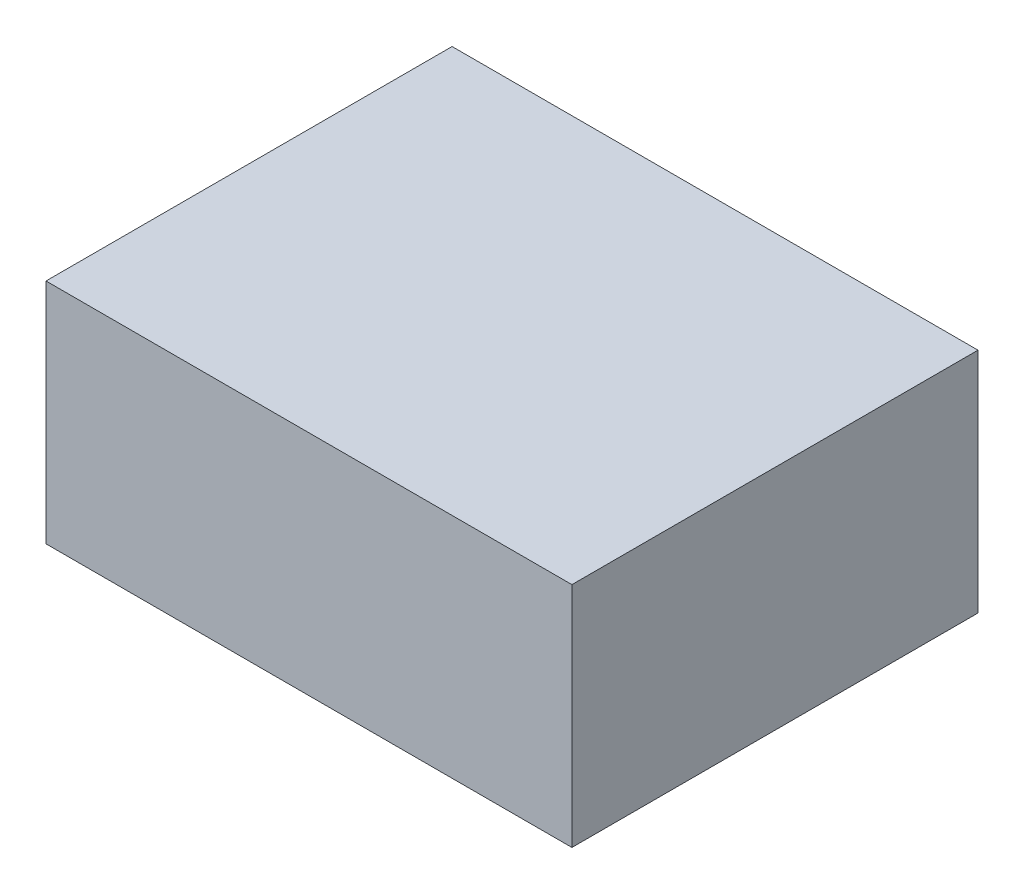
ISO-10303-21;
HEADER;
FILE_DESCRIPTION(('STEP AP214'),'2;1');
FILE_NAME('part.step','',(''),(''),'','','');
FILE_SCHEMA(('AUTOMOTIVE_DESIGN { 1 0 10303 214 1 1 1 1 }'));
ENDSEC;
DATA;
#1=APPLICATION_CONTEXT('core data for automotive mechanical design processes');
#2=APPLICATION_PROTOCOL_DEFINITION('international standard','automotive_design',2000,#1);
#3=PRODUCT_CONTEXT('',#1,'mechanical');
#4=PRODUCT('Part','Part','',(#3));
#5=PRODUCT_RELATED_PRODUCT_CATEGORY('part','',(#4));
#6=PRODUCT_DEFINITION_FORMATION('','',#4);
#7=PRODUCT_DEFINITION_CONTEXT('part definition',#1,'design');
#8=PRODUCT_DEFINITION('design','',#6,#7);
#9=PRODUCT_DEFINITION_SHAPE('','',#8);
#10=(LENGTH_UNIT() NAMED_UNIT(*) SI_UNIT(.MILLI.,.METRE.));
#11=(NAMED_UNIT(*) PLANE_ANGLE_UNIT() SI_UNIT($,.RADIAN.));
#12=(NAMED_UNIT(*) SI_UNIT($,.STERADIAN.) SOLID_ANGLE_UNIT());
#13=UNCERTAINTY_MEASURE_WITH_UNIT(LENGTH_MEASURE(1.E-05),#10,'distance_accuracy_value','');
#14=(GEOMETRIC_REPRESENTATION_CONTEXT(3) GLOBAL_UNCERTAINTY_ASSIGNED_CONTEXT((#13)) GLOBAL_UNIT_ASSIGNED_CONTEXT((#10,
#11,#12)) REPRESENTATION_CONTEXT('',''));
#15=CARTESIAN_POINT('',(0.,0.,0.));
#16=DIRECTION('',(0.,0.,1.));
#17=DIRECTION('',(1.,0.,0.));
#18=AXIS2_PLACEMENT_3D('',#15,#16,#17);
#19=CARTESIAN_POINT('',(57.7540883215222,50.,44.5949289571248));
#20=DIRECTION('',(-1.,0.,0.));
#21=DIRECTION('',(0.,0.,1.));
#22=AXIS2_PLACEMENT_3D('',#19,#20,#21);
#23=PLANE('',#22);
#24=DIRECTION('',(0.,0.,-1.));
#25=VECTOR('',#24,1.);
#26=CARTESIAN_POINT('',(57.7540883215222,0.,44.5949289571248));
#27=LINE('',#26,#25);
#28=CARTESIAN_POINT('',(57.7540883215222,0.,44.5949289571248));
#29=VERTEX_POINT('',#28);
#30=CARTESIAN_POINT('',(57.7540883215222,0.,-44.5949289571248));
#31=VERTEX_POINT('',#30);
#32=EDGE_CURVE('E107',#29,#31,#27,.T.);
#33=ORIENTED_EDGE('',*,*,#32,.T.);
#34=DIRECTION('',(0.,-1.,0.));
#35=VECTOR('',#34,1.);
#36=CARTESIAN_POINT('',(57.7540883215222,50.,-44.5949289571248));
#37=LINE('',#36,#35);
#38=CARTESIAN_POINT('',(57.7540883215222,50.,-44.5949289571248));
#39=VERTEX_POINT('',#38);
#40=EDGE_CURVE('E11',#39,#31,#37,.T.);
#41=ORIENTED_EDGE('',*,*,#40,.F.);
#42=DIRECTION('',(0.,0.,-1.));
#43=VECTOR('',#42,1.);
#44=CARTESIAN_POINT('',(57.7540883215222,50.,44.5949289571248));
#45=LINE('',#44,#43);
#46=CARTESIAN_POINT('',(57.7540883215222,50.,44.5949289571248));
#47=VERTEX_POINT('',#46);
#48=EDGE_CURVE('E91',#47,#39,#45,.T.);
#49=ORIENTED_EDGE('',*,*,#48,.F.);
#50=DIRECTION('',(0.,-1.,0.));
#51=VECTOR('',#50,1.);
#52=CARTESIAN_POINT('',(57.7540883215222,50.,44.5949289571248));
#53=LINE('',#52,#51);
#54=EDGE_CURVE('E103',#47,#29,#53,.T.);
#55=ORIENTED_EDGE('',*,*,#54,.T.);
#56=EDGE_LOOP('',(#33,#41,#49,#55));
#57=FACE_BOUND('',#56,.T.);
#58=ADVANCED_FACE('F39',(#57),#23,.F.);
#59=CARTESIAN_POINT('',(-57.7540883215222,50.,-44.5949289571248));
#60=DIRECTION('',(0.,0.,1.));
#61=DIRECTION('',(1.,0.,0.));
#62=AXIS2_PLACEMENT_3D('',#59,#60,#61);
#63=PLANE('',#62);
#64=DIRECTION('',(-1.,0.,0.));
#65=VECTOR('',#64,1.);
#66=CARTESIAN_POINT('',(-57.7540883215222,0.,-44.5949289571248));
#67=LINE('',#66,#65);
#68=CARTESIAN_POINT('',(-57.7540883215222,0.,-44.5949289571248));
#69=VERTEX_POINT('',#68);
#70=EDGE_CURVE('E96',#31,#69,#67,.T.);
#71=ORIENTED_EDGE('',*,*,#70,.T.);
#72=DIRECTION('',(0.,-1.,0.));
#73=VECTOR('',#72,1.);
#74=CARTESIAN_POINT('',(-57.7540883215222,50.,-44.5949289571248));
#75=LINE('',#74,#73);
#76=CARTESIAN_POINT('',(-57.7540883215222,50.,-44.5949289571248));
#77=VERTEX_POINT('',#76);
#78=EDGE_CURVE('E48',#77,#69,#75,.T.);
#79=ORIENTED_EDGE('',*,*,#78,.F.);
#80=DIRECTION('',(-1.,0.,0.));
#81=VECTOR('',#80,1.);
#82=CARTESIAN_POINT('',(-57.7540883215222,50.,-44.5949289571248));
#83=LINE('',#82,#81);
#84=EDGE_CURVE('E86',#39,#77,#83,.T.);
#85=ORIENTED_EDGE('',*,*,#84,.F.);
#86=ORIENTED_EDGE('',*,*,#40,.T.);
#87=EDGE_LOOP('',(#71,#79,#85,#86));
#88=FACE_BOUND('',#87,.T.);
#89=ADVANCED_FACE('F95',(#88),#63,.F.);
#90=CARTESIAN_POINT('',(-57.7540883215222,50.,44.5949289571248));
#91=DIRECTION('',(1.,0.,0.));
#92=DIRECTION('',(0.,0.,-1.));
#93=AXIS2_PLACEMENT_3D('',#90,#91,#92);
#94=PLANE('',#93);
#95=DIRECTION('',(0.,0.,1.));
#96=VECTOR('',#95,1.);
#97=CARTESIAN_POINT('',(-57.7540883215222,0.,44.5949289571248));
#98=LINE('',#97,#96);
#99=CARTESIAN_POINT('',(-57.7540883215222,0.,44.5949289571248));
#100=VERTEX_POINT('',#99);
#101=EDGE_CURVE('E73',#69,#100,#98,.T.);
#102=ORIENTED_EDGE('',*,*,#101,.T.);
#103=DIRECTION('',(0.,-1.,0.));
#104=VECTOR('',#103,1.);
#105=CARTESIAN_POINT('',(-57.7540883215222,50.,44.5949289571248));
#106=LINE('',#105,#104);
#107=CARTESIAN_POINT('',(-57.7540883215222,50.,44.5949289571248));
#108=VERTEX_POINT('',#107);
#109=EDGE_CURVE('E98',#108,#100,#106,.T.);
#110=ORIENTED_EDGE('',*,*,#109,.F.);
#111=DIRECTION('',(0.,0.,1.));
#112=VECTOR('',#111,1.);
#113=CARTESIAN_POINT('',(-57.7540883215222,50.,44.5949289571248));
#114=LINE('',#113,#112);
#115=EDGE_CURVE('E89',#77,#108,#114,.T.);
#116=ORIENTED_EDGE('',*,*,#115,.F.);
#117=ORIENTED_EDGE('',*,*,#78,.T.);
#118=EDGE_LOOP('',(#102,#110,#116,#117));
#119=FACE_BOUND('',#118,.T.);
#120=ADVANCED_FACE('F99',(#119),#94,.F.);
#121=CARTESIAN_POINT('',(-57.7540883215222,50.,44.5949289571248));
#122=DIRECTION('',(0.,0.,-1.));
#123=DIRECTION('',(-1.,0.,0.));
#124=AXIS2_PLACEMENT_3D('',#121,#122,#123);
#125=PLANE('',#124);
#126=DIRECTION('',(1.,0.,0.));
#127=VECTOR('',#126,1.);
#128=CARTESIAN_POINT('',(-57.7540883215222,0.,44.5949289571248));
#129=LINE('',#128,#127);
#130=EDGE_CURVE('E79',#100,#29,#129,.T.);
#131=ORIENTED_EDGE('',*,*,#130,.T.);
#132=ORIENTED_EDGE('',*,*,#54,.F.);
#133=DIRECTION('',(1.,0.,0.));
#134=VECTOR('',#133,1.);
#135=CARTESIAN_POINT('',(-57.7540883215222,50.,44.5949289571248));
#136=LINE('',#135,#134);
#137=EDGE_CURVE('E56',#108,#47,#136,.T.);
#138=ORIENTED_EDGE('',*,*,#137,.F.);
#139=ORIENTED_EDGE('',*,*,#109,.T.);
#140=EDGE_LOOP('',(#131,#132,#138,#139));
#141=FACE_BOUND('',#140,.T.);
#142=ADVANCED_FACE('F120',(#141),#125,.F.);
#143=CARTESIAN_POINT('',(0.,50.,0.));
#144=DIRECTION('',(0.,-1.,0.));
#145=DIRECTION('',(0.,0.,-1.));
#146=AXIS2_PLACEMENT_3D('',#143,#144,#145);
#147=PLANE('',#146);
#148=ORIENTED_EDGE('',*,*,#48,.T.);
#149=ORIENTED_EDGE('',*,*,#84,.T.);
#150=ORIENTED_EDGE('',*,*,#115,.T.);
#151=ORIENTED_EDGE('',*,*,#137,.T.);
#152=EDGE_LOOP('',(#148,#149,#150,#151));
#153=FACE_BOUND('',#152,.T.);
#154=ADVANCED_FACE('F87',(#153),#147,.F.);
#155=CARTESIAN_POINT('',(0.,0.,0.));
#156=DIRECTION('',(0.,-1.,0.));
#157=DIRECTION('',(0.,0.,-1.));
#158=AXIS2_PLACEMENT_3D('',#155,#156,#157);
#159=PLANE('',#158);
#160=ORIENTED_EDGE('',*,*,#32,.F.);
#161=ORIENTED_EDGE('',*,*,#130,.F.);
#162=ORIENTED_EDGE('',*,*,#101,.F.);
#163=ORIENTED_EDGE('',*,*,#70,.F.);
#164=EDGE_LOOP('',(#160,#161,#162,#163));
#165=FACE_BOUND('',#164,.T.);
#166=ADVANCED_FACE('F123',(#165),#159,.T.);
#167=CLOSED_SHELL('',(#58,#89,#120,#142,#154,#166));
#168=MANIFOLD_SOLID_BREP('B2',#167);
#169=ADVANCED_BREP_SHAPE_REPRESENTATION('',(#18,#168),#14);
#170=SHAPE_DEFINITION_REPRESENTATION(#9,#169);
ENDSEC;
END-ISO-10303-21;
